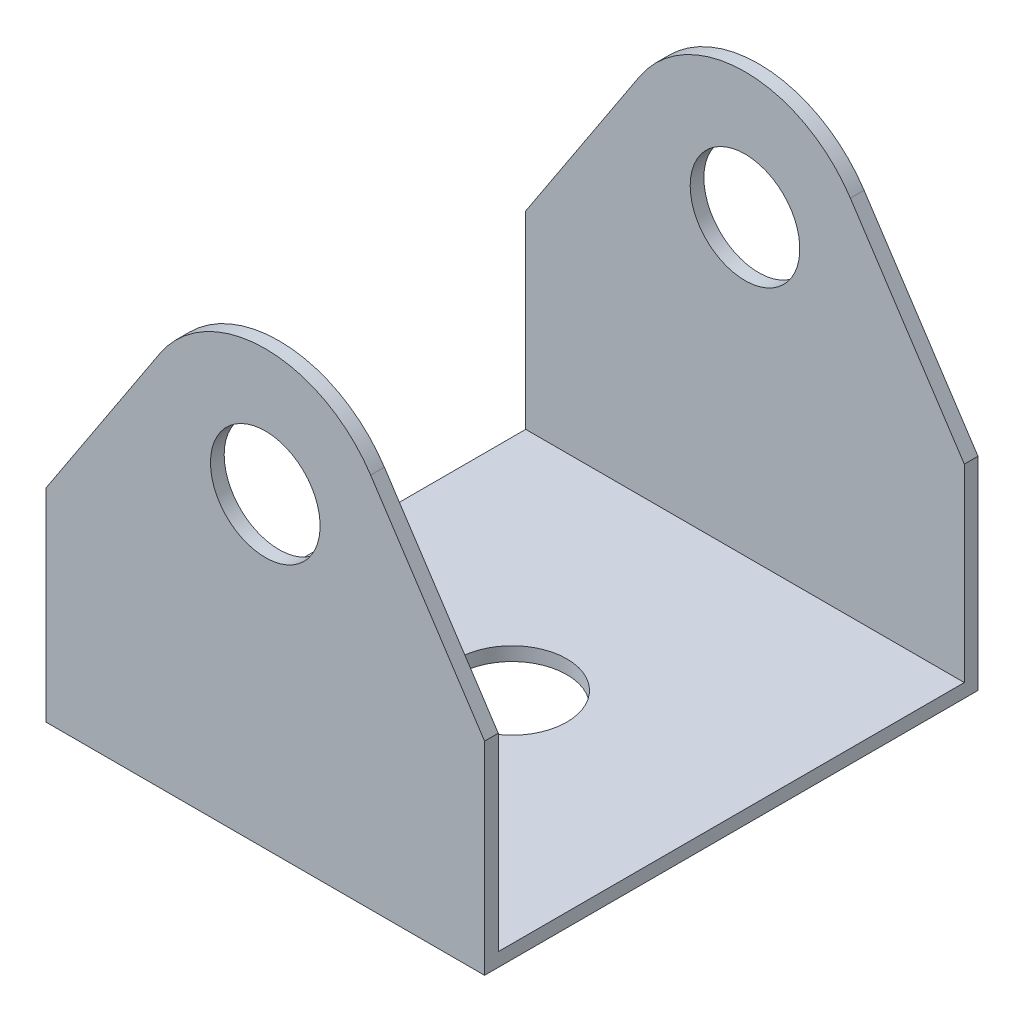
ISO-10303-21;
HEADER;
FILE_DESCRIPTION(('STEP AP214'),'2;1');
FILE_NAME('part.step','',(''),(''),'','','');
FILE_SCHEMA(('AUTOMOTIVE_DESIGN { 1 0 10303 214 1 1 1 1 }'));
ENDSEC;
DATA;
#1=APPLICATION_CONTEXT('core data for automotive mechanical design processes');
#2=APPLICATION_PROTOCOL_DEFINITION('international standard','automotive_design',2000,#1);
#3=PRODUCT_CONTEXT('',#1,'mechanical');
#4=PRODUCT('Part','Part','',(#3));
#5=PRODUCT_RELATED_PRODUCT_CATEGORY('part','',(#4));
#6=PRODUCT_DEFINITION_FORMATION('','',#4);
#7=PRODUCT_DEFINITION_CONTEXT('part definition',#1,'design');
#8=PRODUCT_DEFINITION('design','',#6,#7);
#9=PRODUCT_DEFINITION_SHAPE('','',#8);
#10=(LENGTH_UNIT() NAMED_UNIT(*) SI_UNIT(.MILLI.,.METRE.));
#11=(NAMED_UNIT(*) PLANE_ANGLE_UNIT() SI_UNIT($,.RADIAN.));
#12=(NAMED_UNIT(*) SI_UNIT($,.STERADIAN.) SOLID_ANGLE_UNIT());
#13=UNCERTAINTY_MEASURE_WITH_UNIT(LENGTH_MEASURE(1.E-05),#10,'distance_accuracy_value','');
#14=(GEOMETRIC_REPRESENTATION_CONTEXT(3) GLOBAL_UNCERTAINTY_ASSIGNED_CONTEXT((#13)) GLOBAL_UNIT_ASSIGNED_CONTEXT((#10,
#11,#12)) REPRESENTATION_CONTEXT('',''));
#15=CARTESIAN_POINT('',(0.,0.,0.));
#16=DIRECTION('',(0.,0.,1.));
#17=DIRECTION('',(1.,0.,0.));
#18=AXIS2_PLACEMENT_3D('',#15,#16,#17);
#19=CARTESIAN_POINT('',(40.,-19.,90.));
#20=DIRECTION('',(-0.835794870617099,-0.549041832878103,0.));
#21=DIRECTION('',(0.549041832878103,-0.835794870617099,0.));
#22=AXIS2_PLACEMENT_3D('',#19,#20,#21);
#23=PLANE('',#22);
#24=DIRECTION('',(-0.549041832878103,0.835794870617099,0.));
#25=VECTOR('',#24,1.);
#26=CARTESIAN_POINT('',(40.,-19.,2.5));
#27=LINE('',#26,#25);
#28=CARTESIAN_POINT('',(40.,-19.,2.5));
#29=VERTEX_POINT('',#28);
#30=CARTESIAN_POINT('',(19.2232820241933,12.6279621561964,2.5));
#31=VERTEX_POINT('',#30);
#32=EDGE_CURVE('E158',#29,#31,#27,.T.);
#33=ORIENTED_EDGE('',*,*,#32,.F.);
#34=DIRECTION('',(0.,0.,-1.));
#35=VECTOR('',#34,1.);
#36=CARTESIAN_POINT('',(40.,-19.,90.));
#37=LINE('',#36,#35);
#38=CARTESIAN_POINT('',(40.,-19.,0.));
#39=VERTEX_POINT('',#38);
#40=EDGE_CURVE('E150',#29,#39,#37,.T.);
#41=ORIENTED_EDGE('',*,*,#40,.T.);
#42=DIRECTION('',(-0.549041832878103,0.835794870617099,0.));
#43=VECTOR('',#42,1.);
#44=CARTESIAN_POINT('',(40.,-19.,0.));
#45=LINE('',#44,#43);
#46=CARTESIAN_POINT('',(19.2232820241933,12.6279621561964,0.));
#47=VERTEX_POINT('',#46);
#48=EDGE_CURVE('E167',#39,#47,#45,.T.);
#49=ORIENTED_EDGE('',*,*,#48,.T.);
#50=DIRECTION('',(0.,0.,-1.));
#51=VECTOR('',#50,1.);
#52=CARTESIAN_POINT('',(19.2232820241933,12.6279621561964,90.));
#53=LINE('',#52,#51);
#54=EDGE_CURVE('E46',#31,#47,#53,.T.);
#55=ORIENTED_EDGE('',*,*,#54,.F.);
#56=EDGE_LOOP('',(#33,#41,#49,#55));
#57=FACE_BOUND('',#56,.T.);
#58=ADVANCED_FACE('F37',(#57),#23,.F.);
#59=CARTESIAN_POINT('',(0.,0.,90.));
#60=DIRECTION('',(0.,0.,-1.));
#61=DIRECTION('',(-1.,0.,0.));
#62=AXIS2_PLACEMENT_3D('',#59,#60,#61);
#63=CYLINDRICAL_SURFACE('',#62,23.);
#64=CARTESIAN_POINT('',(0.,0.,2.5));
#65=DIRECTION('',(0.,0.,1.));
#66=DIRECTION('',(1.,0.,0.));
#67=AXIS2_PLACEMENT_3D('',#64,#65,#66);
#68=CIRCLE('',#67,23.);
#69=CARTESIAN_POINT('',(-19.2232820241933,12.6279621561964,2.5));
#70=VERTEX_POINT('',#69);
#71=EDGE_CURVE('E160',#31,#70,#68,.T.);
#72=ORIENTED_EDGE('',*,*,#71,.F.);
#73=ORIENTED_EDGE('',*,*,#54,.T.);
#74=CARTESIAN_POINT('',(0.,0.,0.));
#75=DIRECTION('',(0.,0.,1.));
#76=DIRECTION('',(1.,0.,0.));
#77=AXIS2_PLACEMENT_3D('',#74,#75,#76);
#78=CIRCLE('',#77,23.);
#79=CARTESIAN_POINT('',(-19.2232820241933,12.6279621561964,0.));
#80=VERTEX_POINT('',#79);
#81=EDGE_CURVE('E179',#47,#80,#78,.T.);
#82=ORIENTED_EDGE('',*,*,#81,.T.);
#83=DIRECTION('',(0.,0.,-1.));
#84=VECTOR('',#83,1.);
#85=CARTESIAN_POINT('',(-19.2232820241933,12.6279621561964,90.));
#86=LINE('',#85,#84);
#87=EDGE_CURVE('E215',#70,#80,#86,.T.);
#88=ORIENTED_EDGE('',*,*,#87,.F.);
#89=EDGE_LOOP('',(#72,#73,#82,#88));
#90=FACE_BOUND('',#89,.T.);
#91=ADVANCED_FACE('F267',(#90),#63,.T.);
#92=CARTESIAN_POINT('',(-40.,-19.,90.));
#93=DIRECTION('',(0.835794870617099,-0.549041832878103,0.));
#94=DIRECTION('',(0.549041832878103,0.835794870617099,0.));
#95=AXIS2_PLACEMENT_3D('',#92,#93,#94);
#96=PLANE('',#95);
#97=DIRECTION('',(-0.549041832878103,-0.835794870617099,0.));
#98=VECTOR('',#97,1.);
#99=CARTESIAN_POINT('',(-40.,-19.,2.5));
#100=LINE('',#99,#98);
#101=CARTESIAN_POINT('',(-40.,-19.,2.5));
#102=VERTEX_POINT('',#101);
#103=EDGE_CURVE('E163',#70,#102,#100,.T.);
#104=ORIENTED_EDGE('',*,*,#103,.F.);
#105=ORIENTED_EDGE('',*,*,#87,.T.);
#106=DIRECTION('',(-0.549041832878103,-0.835794870617099,0.));
#107=VECTOR('',#106,1.);
#108=CARTESIAN_POINT('',(-40.,-19.,0.));
#109=LINE('',#108,#107);
#110=CARTESIAN_POINT('',(-40.,-19.,0.));
#111=VERTEX_POINT('',#110);
#112=EDGE_CURVE('E182',#80,#111,#109,.T.);
#113=ORIENTED_EDGE('',*,*,#112,.T.);
#114=DIRECTION('',(0.,0.,-1.));
#115=VECTOR('',#114,1.);
#116=CARTESIAN_POINT('',(-40.,-19.,90.));
#117=LINE('',#116,#115);
#118=EDGE_CURVE('E211',#102,#111,#117,.T.);
#119=ORIENTED_EDGE('',*,*,#118,.F.);
#120=EDGE_LOOP('',(#104,#105,#113,#119));
#121=FACE_BOUND('',#120,.T.);
#122=ADVANCED_FACE('F263',(#121),#96,.F.);
#123=CARTESIAN_POINT('',(-40.,-19.,90.));
#124=DIRECTION('',(1.,0.,0.));
#125=DIRECTION('',(0.,1.,0.));
#126=AXIS2_PLACEMENT_3D('',#123,#124,#125);
#127=PLANE('',#126);
#128=DIRECTION('',(0.,-1.,0.));
#129=VECTOR('',#128,1.);
#130=CARTESIAN_POINT('',(-40.,-19.,2.5));
#131=LINE('',#130,#129);
#132=CARTESIAN_POINT('',(-40.,-53.5,2.5));
#133=VERTEX_POINT('',#132);
#134=EDGE_CURVE('E136',#102,#133,#131,.T.);
#135=ORIENTED_EDGE('',*,*,#134,.F.);
#136=ORIENTED_EDGE('',*,*,#118,.T.);
#137=DIRECTION('',(0.,-1.,0.));
#138=VECTOR('',#137,1.);
#139=CARTESIAN_POINT('',(-40.,-19.,0.));
#140=LINE('',#139,#138);
#141=CARTESIAN_POINT('',(-40.,-56.,0.));
#142=VERTEX_POINT('',#141);
#143=EDGE_CURVE('E185',#111,#142,#140,.T.);
#144=ORIENTED_EDGE('',*,*,#143,.T.);
#145=DIRECTION('',(0.,0.,-1.));
#146=VECTOR('',#145,1.);
#147=CARTESIAN_POINT('',(-40.,-56.,90.));
#148=LINE('',#147,#146);
#149=CARTESIAN_POINT('',(-40.,-56.,90.));
#150=VERTEX_POINT('',#149);
#151=EDGE_CURVE('E208',#150,#142,#148,.T.);
#152=ORIENTED_EDGE('',*,*,#151,.F.);
#153=DIRECTION('',(0.,-1.,0.));
#154=VECTOR('',#153,1.);
#155=CARTESIAN_POINT('',(-40.,-19.,90.));
#156=LINE('',#155,#154);
#157=CARTESIAN_POINT('',(-40.,-19.,90.));
#158=VERTEX_POINT('',#157);
#159=EDGE_CURVE('E197',#158,#150,#156,.T.);
#160=ORIENTED_EDGE('',*,*,#159,.F.);
#161=CARTESIAN_POINT('',(-40.,-19.,87.5));
#162=VERTEX_POINT('',#161);
#163=EDGE_CURVE('E212',#158,#162,#117,.T.);
#164=ORIENTED_EDGE('',*,*,#163,.T.);
#165=DIRECTION('',(0.,-1.,0.));
#166=VECTOR('',#165,1.);
#167=CARTESIAN_POINT('',(-40.,-19.,87.5));
#168=LINE('',#167,#166);
#169=CARTESIAN_POINT('',(-40.,-53.5,87.5));
#170=VERTEX_POINT('',#169);
#171=EDGE_CURVE('E168',#162,#170,#168,.T.);
#172=ORIENTED_EDGE('',*,*,#171,.T.);
#173=DIRECTION('',(0.,0.,-1.));
#174=VECTOR('',#173,1.);
#175=CARTESIAN_POINT('',(-40.,-53.5,90.));
#176=LINE('',#175,#174);
#177=EDGE_CURVE('E145',#170,#133,#176,.T.);
#178=ORIENTED_EDGE('',*,*,#177,.T.);
#179=EDGE_LOOP('',(#135,#136,#144,#152,#160,#164,#172,#178));
#180=FACE_BOUND('',#179,.T.);
#181=ADVANCED_FACE('F258',(#180),#127,.F.);
#182=CARTESIAN_POINT('',(40.,-19.,90.));
#183=DIRECTION('',(-1.,0.,0.));
#184=DIRECTION('',(0.,-1.,0.));
#185=AXIS2_PLACEMENT_3D('',#182,#183,#184);
#186=PLANE('',#185);
#187=DIRECTION('',(0.,1.,0.));
#188=VECTOR('',#187,1.);
#189=CARTESIAN_POINT('',(40.,-19.,2.5));
#190=LINE('',#189,#188);
#191=CARTESIAN_POINT('',(40.,-53.5,2.5));
#192=VERTEX_POINT('',#191);
#193=EDGE_CURVE('E133',#192,#29,#190,.T.);
#194=ORIENTED_EDGE('',*,*,#193,.F.);
#195=DIRECTION('',(0.,0.,-1.));
#196=VECTOR('',#195,1.);
#197=CARTESIAN_POINT('',(40.,-53.5,90.));
#198=LINE('',#197,#196);
#199=CARTESIAN_POINT('',(40.,-53.5,87.5));
#200=VERTEX_POINT('',#199);
#201=EDGE_CURVE('E141',#200,#192,#198,.T.);
#202=ORIENTED_EDGE('',*,*,#201,.F.);
#203=DIRECTION('',(0.,1.,0.));
#204=VECTOR('',#203,1.);
#205=CARTESIAN_POINT('',(40.,-19.,87.5));
#206=LINE('',#205,#204);
#207=CARTESIAN_POINT('',(40.,-19.,87.5));
#208=VERTEX_POINT('',#207);
#209=EDGE_CURVE('E54',#200,#208,#206,.T.);
#210=ORIENTED_EDGE('',*,*,#209,.T.);
#211=CARTESIAN_POINT('',(40.,-19.,90.));
#212=VERTEX_POINT('',#211);
#213=EDGE_CURVE('E202',#212,#208,#37,.T.);
#214=ORIENTED_EDGE('',*,*,#213,.F.);
#215=DIRECTION('',(0.,1.,0.));
#216=VECTOR('',#215,1.);
#217=CARTESIAN_POINT('',(40.,-19.,90.));
#218=LINE('',#217,#216);
#219=CARTESIAN_POINT('',(40.,-56.,90.));
#220=VERTEX_POINT('',#219);
#221=EDGE_CURVE('E62',#220,#212,#218,.T.);
#222=ORIENTED_EDGE('',*,*,#221,.F.);
#223=DIRECTION('',(0.,0.,-1.));
#224=VECTOR('',#223,1.);
#225=CARTESIAN_POINT('',(40.,-56.,90.));
#226=LINE('',#225,#224);
#227=CARTESIAN_POINT('',(40.,-56.,0.));
#228=VERTEX_POINT('',#227);
#229=EDGE_CURVE('E205',#220,#228,#226,.T.);
#230=ORIENTED_EDGE('',*,*,#229,.T.);
#231=DIRECTION('',(0.,1.,0.));
#232=VECTOR('',#231,1.);
#233=CARTESIAN_POINT('',(40.,-19.,0.));
#234=LINE('',#233,#232);
#235=EDGE_CURVE('E189',#228,#39,#234,.T.);
#236=ORIENTED_EDGE('',*,*,#235,.T.);
#237=ORIENTED_EDGE('',*,*,#40,.F.);
#238=EDGE_LOOP('',(#194,#202,#210,#214,#222,#230,#236,#237));
#239=FACE_BOUND('',#238,.T.);
#240=ADVANCED_FACE('F148',(#239),#186,.F.);
#241=ORIENTED_EDGE('',*,*,#213,.T.);
#242=DIRECTION('',(-0.549041832878103,0.835794870617099,0.));
#243=VECTOR('',#242,1.);
#244=CARTESIAN_POINT('',(40.,-19.,87.5));
#245=LINE('',#244,#243);
#246=CARTESIAN_POINT('',(19.2232820241933,12.6279621561964,87.5));
#247=VERTEX_POINT('',#246);
#248=EDGE_CURVE('E151',#208,#247,#245,.T.);
#249=ORIENTED_EDGE('',*,*,#248,.T.);
#250=CARTESIAN_POINT('',(19.2232820241933,12.6279621561964,90.));
#251=VERTEX_POINT('',#250);
#252=EDGE_CURVE('E11',#251,#247,#53,.T.);
#253=ORIENTED_EDGE('',*,*,#252,.F.);
#254=DIRECTION('',(-0.549041832878103,0.835794870617099,0.));
#255=VECTOR('',#254,1.);
#256=CARTESIAN_POINT('',(40.,-19.,90.));
#257=LINE('',#256,#255);
#258=EDGE_CURVE('E191',#212,#251,#257,.T.);
#259=ORIENTED_EDGE('',*,*,#258,.F.);
#260=EDGE_LOOP('',(#241,#249,#253,#259));
#261=FACE_BOUND('',#260,.T.);
#262=ADVANCED_FACE('F39',(#261),#23,.F.);
#263=ORIENTED_EDGE('',*,*,#252,.T.);
#264=CARTESIAN_POINT('',(0.,0.,87.5));
#265=DIRECTION('',(0.,0.,1.));
#266=DIRECTION('',(1.,0.,0.));
#267=AXIS2_PLACEMENT_3D('',#264,#265,#266);
#268=CIRCLE('',#267,23.);
#269=CARTESIAN_POINT('',(-19.2232820241933,12.6279621561964,87.5));
#270=VERTEX_POINT('',#269);
#271=EDGE_CURVE('E154',#247,#270,#268,.T.);
#272=ORIENTED_EDGE('',*,*,#271,.T.);
#273=CARTESIAN_POINT('',(-19.2232820241933,12.6279621561964,90.));
#274=VERTEX_POINT('',#273);
#275=EDGE_CURVE('E216',#274,#270,#86,.T.);
#276=ORIENTED_EDGE('',*,*,#275,.F.);
#277=CARTESIAN_POINT('',(0.,0.,90.));
#278=DIRECTION('',(0.,0.,1.));
#279=DIRECTION('',(1.,0.,0.));
#280=AXIS2_PLACEMENT_3D('',#277,#278,#279);
#281=CIRCLE('',#280,23.);
#282=EDGE_CURVE('E193',#251,#274,#281,.T.);
#283=ORIENTED_EDGE('',*,*,#282,.F.);
#284=EDGE_LOOP('',(#263,#272,#276,#283));
#285=FACE_BOUND('',#284,.T.);
#286=ADVANCED_FACE('F269',(#285),#63,.T.);
#287=ORIENTED_EDGE('',*,*,#275,.T.);
#288=DIRECTION('',(-0.549041832878103,-0.835794870617099,0.));
#289=VECTOR('',#288,1.);
#290=CARTESIAN_POINT('',(-40.,-19.,87.5));
#291=LINE('',#290,#289);
#292=EDGE_CURVE('E171',#270,#162,#291,.T.);
#293=ORIENTED_EDGE('',*,*,#292,.T.);
#294=ORIENTED_EDGE('',*,*,#163,.F.);
#295=DIRECTION('',(-0.549041832878103,-0.835794870617099,0.));
#296=VECTOR('',#295,1.);
#297=CARTESIAN_POINT('',(-40.,-19.,90.));
#298=LINE('',#297,#296);
#299=EDGE_CURVE('E195',#274,#158,#298,.T.);
#300=ORIENTED_EDGE('',*,*,#299,.F.);
#301=EDGE_LOOP('',(#287,#293,#294,#300));
#302=FACE_BOUND('',#301,.T.);
#303=ADVANCED_FACE('F275',(#302),#96,.F.);
#304=CARTESIAN_POINT('',(40.,-56.,90.));
#305=DIRECTION('',(0.,1.,0.));
#306=DIRECTION('',(0.,0.,1.));
#307=AXIS2_PLACEMENT_3D('',#304,#305,#306);
#308=PLANE('',#307);
#309=CARTESIAN_POINT('',(0.,-56.,45.));
#310=DIRECTION('',(0.,-1.,0.));
#311=DIRECTION('',(0.,0.,-1.));
#312=AXIS2_PLACEMENT_3D('',#309,#310,#311);
#313=CIRCLE('',#312,10.);
#314=CARTESIAN_POINT('',(0.,-56.,35.));
#315=VERTEX_POINT('',#314);
#316=EDGE_CURVE('E219',#315,#315,#313,.T.);
#317=ORIENTED_EDGE('',*,*,#316,.F.);
#318=EDGE_LOOP('',(#317));
#319=FACE_BOUND('',#318,.T.);
#320=DIRECTION('',(1.,0.,0.));
#321=VECTOR('',#320,1.);
#322=CARTESIAN_POINT('',(40.,-56.,0.));
#323=LINE('',#322,#321);
#324=EDGE_CURVE('E187',#142,#228,#323,.T.);
#325=ORIENTED_EDGE('',*,*,#324,.T.);
#326=ORIENTED_EDGE('',*,*,#229,.F.);
#327=DIRECTION('',(1.,0.,0.));
#328=VECTOR('',#327,1.);
#329=CARTESIAN_POINT('',(40.,-56.,90.));
#330=LINE('',#329,#328);
#331=EDGE_CURVE('E199',#150,#220,#330,.T.);
#332=ORIENTED_EDGE('',*,*,#331,.F.);
#333=ORIENTED_EDGE('',*,*,#151,.T.);
#334=EDGE_LOOP('',(#325,#326,#332,#333));
#335=FACE_BOUND('',#334,.T.);
#336=ADVANCED_FACE('F254',(#319,#335),#308,.F.);
#337=CARTESIAN_POINT('',(0.,0.,90.));
#338=DIRECTION('',(0.,0.,1.));
#339=DIRECTION('',(1.,0.,0.));
#340=AXIS2_PLACEMENT_3D('',#337,#338,#339);
#341=PLANE('',#340);
#342=CARTESIAN_POINT('',(0.,0.,90.));
#343=DIRECTION('',(0.,0.,-1.));
#344=DIRECTION('',(-1.,0.,0.));
#345=AXIS2_PLACEMENT_3D('',#342,#343,#344);
#346=CIRCLE('',#345,10.);
#347=CARTESIAN_POINT('',(-10.,0.,90.));
#348=VERTEX_POINT('',#347);
#349=EDGE_CURVE('E230',#348,#348,#346,.T.);
#350=ORIENTED_EDGE('',*,*,#349,.T.);
#351=EDGE_LOOP('',(#350));
#352=FACE_BOUND('',#351,.T.);
#353=ORIENTED_EDGE('',*,*,#258,.T.);
#354=ORIENTED_EDGE('',*,*,#282,.T.);
#355=ORIENTED_EDGE('',*,*,#299,.T.);
#356=ORIENTED_EDGE('',*,*,#159,.T.);
#357=ORIENTED_EDGE('',*,*,#331,.T.);
#358=ORIENTED_EDGE('',*,*,#221,.T.);
#359=EDGE_LOOP('',(#353,#354,#355,#356,#357,#358));
#360=FACE_BOUND('',#359,.T.);
#361=ADVANCED_FACE('F242',(#352,#360),#341,.T.);
#362=CARTESIAN_POINT('',(0.,0.,0.));
#363=DIRECTION('',(0.,0.,1.));
#364=DIRECTION('',(1.,0.,0.));
#365=AXIS2_PLACEMENT_3D('',#362,#363,#364);
#366=PLANE('',#365);
#367=CARTESIAN_POINT('',(0.,0.,0.));
#368=DIRECTION('',(0.,0.,-1.));
#369=DIRECTION('',(-1.,0.,0.));
#370=AXIS2_PLACEMENT_3D('',#367,#368,#369);
#371=CIRCLE('',#370,10.);
#372=CARTESIAN_POINT('',(-10.,0.,0.));
#373=VERTEX_POINT('',#372);
#374=EDGE_CURVE('E233',#373,#373,#371,.T.);
#375=ORIENTED_EDGE('',*,*,#374,.F.);
#376=EDGE_LOOP('',(#375));
#377=FACE_BOUND('',#376,.T.);
#378=ORIENTED_EDGE('',*,*,#48,.F.);
#379=ORIENTED_EDGE('',*,*,#235,.F.);
#380=ORIENTED_EDGE('',*,*,#324,.F.);
#381=ORIENTED_EDGE('',*,*,#143,.F.);
#382=ORIENTED_EDGE('',*,*,#112,.F.);
#383=ORIENTED_EDGE('',*,*,#81,.F.);
#384=EDGE_LOOP('',(#378,#379,#380,#381,#382,#383));
#385=FACE_BOUND('',#384,.T.);
#386=ADVANCED_FACE('F239',(#377,#385),#366,.F.);
#387=CARTESIAN_POINT('',(40.,-53.5,90.));
#388=DIRECTION('',(0.,1.,0.));
#389=DIRECTION('',(0.,0.,1.));
#390=AXIS2_PLACEMENT_3D('',#387,#388,#389);
#391=PLANE('',#390);
#392=CARTESIAN_POINT('',(0.,-53.5,45.));
#393=DIRECTION('',(0.,1.,0.));
#394=DIRECTION('',(0.,0.,1.));
#395=AXIS2_PLACEMENT_3D('',#392,#393,#394);
#396=CIRCLE('',#395,10.);
#397=CARTESIAN_POINT('',(0.,-53.5,35.));
#398=VERTEX_POINT('',#397);
#399=EDGE_CURVE('E161',#398,#398,#396,.T.);
#400=ORIENTED_EDGE('',*,*,#399,.F.);
#401=EDGE_LOOP('',(#400));
#402=FACE_BOUND('',#401,.T.);
#403=DIRECTION('',(1.,0.,0.));
#404=VECTOR('',#403,1.);
#405=CARTESIAN_POINT('',(40.,-53.5,2.5));
#406=LINE('',#405,#404);
#407=EDGE_CURVE('E129',#133,#192,#406,.T.);
#408=ORIENTED_EDGE('',*,*,#407,.F.);
#409=ORIENTED_EDGE('',*,*,#177,.F.);
#410=DIRECTION('',(1.,0.,0.));
#411=VECTOR('',#410,1.);
#412=CARTESIAN_POINT('',(40.,-53.5,87.5));
#413=LINE('',#412,#411);
#414=EDGE_CURVE('E143',#170,#200,#413,.T.);
#415=ORIENTED_EDGE('',*,*,#414,.T.);
#416=ORIENTED_EDGE('',*,*,#201,.T.);
#417=EDGE_LOOP('',(#408,#409,#415,#416));
#418=FACE_BOUND('',#417,.T.);
#419=ADVANCED_FACE('F142',(#402,#418),#391,.T.);
#420=CARTESIAN_POINT('',(0.,0.,87.5));
#421=DIRECTION('',(0.,0.,1.));
#422=DIRECTION('',(1.,0.,0.));
#423=AXIS2_PLACEMENT_3D('',#420,#421,#422);
#424=PLANE('',#423);
#425=CARTESIAN_POINT('',(0.,0.,87.5));
#426=DIRECTION('',(0.,0.,1.));
#427=DIRECTION('',(1.,0.,0.));
#428=AXIS2_PLACEMENT_3D('',#425,#426,#427);
#429=CIRCLE('',#428,10.);
#430=CARTESIAN_POINT('',(-10.,0.,87.5));
#431=VERTEX_POINT('',#430);
#432=EDGE_CURVE('E223',#431,#431,#429,.T.);
#433=ORIENTED_EDGE('',*,*,#432,.T.);
#434=EDGE_LOOP('',(#433));
#435=FACE_BOUND('',#434,.T.);
#436=ORIENTED_EDGE('',*,*,#248,.F.);
#437=ORIENTED_EDGE('',*,*,#209,.F.);
#438=ORIENTED_EDGE('',*,*,#414,.F.);
#439=ORIENTED_EDGE('',*,*,#171,.F.);
#440=ORIENTED_EDGE('',*,*,#292,.F.);
#441=ORIENTED_EDGE('',*,*,#271,.F.);
#442=EDGE_LOOP('',(#436,#437,#438,#439,#440,#441));
#443=FACE_BOUND('',#442,.T.);
#444=ADVANCED_FACE('F287',(#435,#443),#424,.F.);
#445=CARTESIAN_POINT('',(0.,0.,2.5));
#446=DIRECTION('',(0.,0.,1.));
#447=DIRECTION('',(1.,0.,0.));
#448=AXIS2_PLACEMENT_3D('',#445,#446,#447);
#449=PLANE('',#448);
#450=CARTESIAN_POINT('',(0.,0.,2.5));
#451=DIRECTION('',(0.,0.,1.));
#452=DIRECTION('',(1.,0.,0.));
#453=AXIS2_PLACEMENT_3D('',#450,#451,#452);
#454=CIRCLE('',#453,10.);
#455=CARTESIAN_POINT('',(-10.,0.,2.49999999999999));
#456=VERTEX_POINT('',#455);
#457=EDGE_CURVE('E41',#456,#456,#454,.T.);
#458=ORIENTED_EDGE('',*,*,#457,.F.);
#459=EDGE_LOOP('',(#458));
#460=FACE_BOUND('',#459,.T.);
#461=ORIENTED_EDGE('',*,*,#32,.T.);
#462=ORIENTED_EDGE('',*,*,#71,.T.);
#463=ORIENTED_EDGE('',*,*,#103,.T.);
#464=ORIENTED_EDGE('',*,*,#134,.T.);
#465=ORIENTED_EDGE('',*,*,#407,.T.);
#466=ORIENTED_EDGE('',*,*,#193,.T.);
#467=EDGE_LOOP('',(#461,#462,#463,#464,#465,#466));
#468=FACE_BOUND('',#467,.T.);
#469=ADVANCED_FACE('F131',(#460,#468),#449,.T.);
#470=CARTESIAN_POINT('',(0.,34.,45.));
#471=DIRECTION('',(0.,-1.,0.));
#472=DIRECTION('',(0.,0.,-1.));
#473=AXIS2_PLACEMENT_3D('',#470,#471,#472);
#474=CYLINDRICAL_SURFACE('',#473,10.);
#475=CARTESIAN_POINT('',(0.,-53.5,35.));
#476=CARTESIAN_POINT('',(0.,-53.5260416666667,35.));
#477=CARTESIAN_POINT('',(0.,-53.5520833333333,35.));
#478=CARTESIAN_POINT('',(0.,-53.6041666666667,35.));
#479=CARTESIAN_POINT('',(0.,-53.6302083333333,35.));
#480=CARTESIAN_POINT('',(0.,-53.6822916666667,35.));
#481=CARTESIAN_POINT('',(0.,-53.7083333333333,35.));
#482=CARTESIAN_POINT('',(0.,-53.7604166666667,35.));
#483=CARTESIAN_POINT('',(0.,-53.7864583333333,35.));
#484=CARTESIAN_POINT('',(0.,-53.8385416666667,35.));
#485=CARTESIAN_POINT('',(0.,-53.8645833333333,35.));
#486=CARTESIAN_POINT('',(0.,-53.9166666666667,35.));
#487=CARTESIAN_POINT('',(0.,-53.9427083333333,35.));
#488=CARTESIAN_POINT('',(0.,-53.9947916666667,35.));
#489=CARTESIAN_POINT('',(0.,-54.0208333333333,35.));
#490=CARTESIAN_POINT('',(0.,-54.0729166666667,35.));
#491=CARTESIAN_POINT('',(0.,-54.0989583333333,35.));
#492=CARTESIAN_POINT('',(0.,-54.1510416666667,35.));
#493=CARTESIAN_POINT('',(0.,-54.1770833333333,35.));
#494=CARTESIAN_POINT('',(0.,-54.2291666666667,35.));
#495=CARTESIAN_POINT('',(0.,-54.2552083333333,35.));
#496=CARTESIAN_POINT('',(0.,-54.3072916666667,35.));
#497=CARTESIAN_POINT('',(0.,-54.3333333333333,35.));
#498=CARTESIAN_POINT('',(0.,-54.3854166666667,35.));
#499=CARTESIAN_POINT('',(0.,-54.4114583333333,35.));
#500=CARTESIAN_POINT('',(0.,-54.4635416666667,35.));
#501=CARTESIAN_POINT('',(0.,-54.4895833333333,35.));
#502=CARTESIAN_POINT('',(0.,-54.5416666666667,35.));
#503=CARTESIAN_POINT('',(0.,-54.5677083333333,35.));
#504=CARTESIAN_POINT('',(0.,-54.6197916666667,35.));
#505=CARTESIAN_POINT('',(0.,-54.6458333333333,35.));
#506=CARTESIAN_POINT('',(0.,-54.6979166666667,35.));
#507=CARTESIAN_POINT('',(0.,-54.7239583333333,35.));
#508=CARTESIAN_POINT('',(0.,-54.7760416666667,35.));
#509=CARTESIAN_POINT('',(0.,-54.8020833333333,35.));
#510=CARTESIAN_POINT('',(0.,-54.8541666666667,35.));
#511=CARTESIAN_POINT('',(0.,-54.8802083333333,35.));
#512=CARTESIAN_POINT('',(0.,-54.9322916666667,35.));
#513=CARTESIAN_POINT('',(0.,-54.9583333333333,35.));
#514=CARTESIAN_POINT('',(0.,-55.0104166666667,35.));
#515=CARTESIAN_POINT('',(0.,-55.0364583333333,35.));
#516=CARTESIAN_POINT('',(0.,-55.0885416666667,35.));
#517=CARTESIAN_POINT('',(0.,-55.1145833333333,35.));
#518=CARTESIAN_POINT('',(0.,-55.1666666666667,35.));
#519=CARTESIAN_POINT('',(0.,-55.1927083333333,35.));
#520=CARTESIAN_POINT('',(0.,-55.2447916666667,35.));
#521=CARTESIAN_POINT('',(0.,-55.2708333333333,35.));
#522=CARTESIAN_POINT('',(0.,-55.3229166666667,35.));
#523=CARTESIAN_POINT('',(0.,-55.3489583333333,35.));
#524=CARTESIAN_POINT('',(0.,-55.4010416666667,35.));
#525=CARTESIAN_POINT('',(0.,-55.4270833333333,35.));
#526=CARTESIAN_POINT('',(0.,-55.4791666666667,35.));
#527=CARTESIAN_POINT('',(0.,-55.5052083333333,35.));
#528=CARTESIAN_POINT('',(0.,-55.5572916666667,35.));
#529=CARTESIAN_POINT('',(0.,-55.5833333333333,35.));
#530=CARTESIAN_POINT('',(0.,-55.6354166666667,35.));
#531=CARTESIAN_POINT('',(0.,-55.6614583333333,35.));
#532=CARTESIAN_POINT('',(0.,-55.7135416666667,35.));
#533=CARTESIAN_POINT('',(0.,-55.7395833333333,35.));
#534=CARTESIAN_POINT('',(0.,-55.7916666666667,35.));
#535=CARTESIAN_POINT('',(0.,-55.8177083333333,35.));
#536=CARTESIAN_POINT('',(0.,-55.8697916666667,35.));
#537=CARTESIAN_POINT('',(0.,-55.8958333333333,35.));
#538=CARTESIAN_POINT('',(0.,-55.9479166666667,35.));
#539=CARTESIAN_POINT('',(0.,-55.9739583333333,35.));
#540=CARTESIAN_POINT('',(0.,-56.,35.));
#541=B_SPLINE_CURVE_WITH_KNOTS('',3,(#475,#476,#477,#478,#479,#480,#481,#482,#483,#484,#485,
#486,#487,#488,#489,#490,#491,#492,#493,#494,#495,#496,#497,#498,#499,#500,#501,#502,#503,#504,
#505,#506,#507,#508,#509,#510,#511,#512,#513,#514,#515,#516,#517,#518,#519,#520,#521,#522,#523,
#524,#525,#526,#527,#528,#529,#530,#531,#532,#533,#534,#535,#536,#537,#538,#539,#540),
.UNSPECIFIED.,.F.,.F.,(4,2,2,2,2,2,2,2,2,2,2,2,2,2,2,2,2,2,2,2,2,2,2,2,2,2,2,2,2,2,2,2,4),(0.,
0.0781249999999983,0.156249999999997,0.234374999999995,0.312499999999993,0.390625000000006,
0.468750000000004,0.546875000000002,0.625000000000001,0.703124999999999,0.781249999999997,
0.859374999999996,0.937500000000008,1.01562500000001,1.09375,1.171875,1.25,1.328125,1.40625,
1.484375,1.56249999999999,1.64062500000001,1.71875,1.796875,1.875,1.953125,2.03125,2.109375,
2.18750000000001,2.26562500000001,2.34375000000001,2.421875,2.5),.UNSPECIFIED.);
#542=EDGE_CURVE('BSEAM349',#398,#315,#541,.T.);
#543=ORIENTED_EDGE('',*,*,#399,.T.);
#544=ORIENTED_EDGE('',*,*,#316,.T.);
#545=ORIENTED_EDGE('',*,*,#542,.T.);
#546=ORIENTED_EDGE('',*,*,#542,.F.);
#547=EDGE_LOOP('',(#543,#545,#544,#546));
#548=FACE_BOUND('',#547,.T.);
#549=ADVANCED_FACE('F349',(#548),#474,.F.);
#550=CARTESIAN_POINT('',(0.,0.,90.));
#551=DIRECTION('',(0.,0.,-1.));
#552=DIRECTION('',(-1.,0.,0.));
#553=AXIS2_PLACEMENT_3D('',#550,#551,#552);
#554=CYLINDRICAL_SURFACE('',#553,10.);
#555=CARTESIAN_POINT('',(-10.,0.,2.49999999999999));
#556=CARTESIAN_POINT('',(-10.,0.,2.47395833333332));
#557=CARTESIAN_POINT('',(-10.,0.,2.44791666666666));
#558=CARTESIAN_POINT('',(-10.,0.,2.39583333333332));
#559=CARTESIAN_POINT('',(-10.,0.,2.36979166666666));
#560=CARTESIAN_POINT('',(-10.,0.,2.31770833333333));
#561=CARTESIAN_POINT('',(-10.,0.,2.29166666666666));
#562=CARTESIAN_POINT('',(-10.,0.,2.23958333333333));
#563=CARTESIAN_POINT('',(-10.,0.,2.21354166666666));
#564=CARTESIAN_POINT('',(-10.,0.,2.16145833333333));
#565=CARTESIAN_POINT('',(-10.,0.,2.13541666666666));
#566=CARTESIAN_POINT('',(-10.,0.,2.08333333333333));
#567=CARTESIAN_POINT('',(-10.,0.,2.05729166666666));
#568=CARTESIAN_POINT('',(-10.,0.,2.00520833333333));
#569=CARTESIAN_POINT('',(-10.,0.,1.97916666666667));
#570=CARTESIAN_POINT('',(-10.,0.,1.92708333333333));
#571=CARTESIAN_POINT('',(-10.,0.,1.90104166666667));
#572=CARTESIAN_POINT('',(-10.,0.,1.84895833333333));
#573=CARTESIAN_POINT('',(-10.,0.,1.82291666666666));
#574=CARTESIAN_POINT('',(-10.,0.,1.77083333333332));
#575=CARTESIAN_POINT('',(-10.,0.,1.74479166666666));
#576=CARTESIAN_POINT('',(-10.,0.,1.69270833333333));
#577=CARTESIAN_POINT('',(-10.,0.,1.66666666666666));
#578=CARTESIAN_POINT('',(-10.,0.,1.61458333333333));
#579=CARTESIAN_POINT('',(-10.,0.,1.58854166666666));
#580=CARTESIAN_POINT('',(-10.,0.,1.53645833333333));
#581=CARTESIAN_POINT('',(-10.,0.,1.51041666666666));
#582=CARTESIAN_POINT('',(-10.,0.,1.45833333333333));
#583=CARTESIAN_POINT('',(-10.,0.,1.43229166666666));
#584=CARTESIAN_POINT('',(-10.,0.,1.38020833333333));
#585=CARTESIAN_POINT('',(-10.,0.,1.35416666666667));
#586=CARTESIAN_POINT('',(-10.,0.,1.30208333333333));
#587=CARTESIAN_POINT('',(-10.,0.,1.27604166666667));
#588=CARTESIAN_POINT('',(-10.,0.,1.22395833333334));
#589=CARTESIAN_POINT('',(-10.,0.,1.19791666666667));
#590=CARTESIAN_POINT('',(-10.,0.,1.14583333333334));
#591=CARTESIAN_POINT('',(-10.,0.,1.11979166666667));
#592=CARTESIAN_POINT('',(-10.,0.,1.06770833333334));
#593=CARTESIAN_POINT('',(-10.,0.,1.04166666666667));
#594=CARTESIAN_POINT('',(-10.,0.,0.98958333333334));
#595=CARTESIAN_POINT('',(-10.,0.,0.963541666666674));
#596=CARTESIAN_POINT('',(-10.,0.,0.911458333333342));
#597=CARTESIAN_POINT('',(-10.,0.,0.885416666666676));
#598=CARTESIAN_POINT('',(-10.,0.,0.833333333333343));
#599=CARTESIAN_POINT('',(-10.,0.,0.807291666666677));
#600=CARTESIAN_POINT('',(-10.,0.,0.755208333333345));
#601=CARTESIAN_POINT('',(-10.,0.,0.729166666666679));
#602=CARTESIAN_POINT('',(-10.,0.,0.677083333333342));
#603=CARTESIAN_POINT('',(-10.,0.,0.651041666666671));
#604=CARTESIAN_POINT('',(-10.,0.,0.598958333333334));
#605=CARTESIAN_POINT('',(-10.,0.,0.572916666666668));
#606=CARTESIAN_POINT('',(-10.,0.,0.520833333333336));
#607=CARTESIAN_POINT('',(-10.,0.,0.49479166666667));
#608=CARTESIAN_POINT('',(-10.,0.,0.442708333333338));
#609=CARTESIAN_POINT('',(-10.,0.,0.416666666666672));
#610=CARTESIAN_POINT('',(-10.,0.,0.364583333333339));
#611=CARTESIAN_POINT('',(-10.,0.,0.338541666666673));
#612=CARTESIAN_POINT('',(-10.,0.,0.286458333333341));
#613=CARTESIAN_POINT('',(-10.,0.,0.260416666666675));
#614=CARTESIAN_POINT('',(-10.,0.,0.208333333333343));
#615=CARTESIAN_POINT('',(-10.,0.,0.182291666666677));
#616=CARTESIAN_POINT('',(-10.,0.,0.130208333333344));
#617=CARTESIAN_POINT('',(-10.,0.,0.104166666666678));
#618=CARTESIAN_POINT('',(-10.,0.,0.0520833333333461));
#619=CARTESIAN_POINT('',(-10.,0.,0.02604166666668));
#620=CARTESIAN_POINT('',(-10.,0.,0.));
#621=B_SPLINE_CURVE_WITH_KNOTS('',3,(#555,#556,#557,#558,#559,#560,#561,#562,#563,#564,#565,
#566,#567,#568,#569,#570,#571,#572,#573,#574,#575,#576,#577,#578,#579,#580,#581,#582,#583,#584,
#585,#586,#587,#588,#589,#590,#591,#592,#593,#594,#595,#596,#597,#598,#599,#600,#601,#602,#603,
#604,#605,#606,#607,#608,#609,#610,#611,#612,#613,#614,#615,#616,#617,#618,#619,#620),
.UNSPECIFIED.,.F.,.F.,(4,2,2,2,2,2,2,2,2,2,2,2,2,2,2,2,2,2,2,2,2,2,2,2,2,2,2,2,2,2,2,2,4),(0.,
0.0781249999999983,0.156249999999997,0.234374999999995,0.312499999999993,0.390624999999992,
0.46874999999999,0.546874999999988,0.624999999999987,0.703124999999999,0.781249999999997,
0.859374999999996,0.937499999999994,1.01562499999999,1.09374999999999,1.17187499999999,
1.24999999999999,1.32812499999999,1.40624999999998,1.48437499999998,1.56249999999998,
1.64062499999998,1.71874999999998,1.79687499999998,1.87499999999999,1.95312499999999,
2.03124999999998,2.10937499999998,2.18749999999998,2.26562499999998,2.34374999999998,
2.42187499999998,2.49999999999997),.UNSPECIFIED.);
#622=EDGE_CURVE('BSEAM237',#456,#373,#621,.T.);
#623=ORIENTED_EDGE('',*,*,#457,.T.);
#624=ORIENTED_EDGE('',*,*,#374,.T.);
#625=ORIENTED_EDGE('',*,*,#622,.T.);
#626=ORIENTED_EDGE('',*,*,#622,.F.);
#627=EDGE_LOOP('',(#623,#625,#624,#626));
#628=FACE_BOUND('',#627,.T.);
#629=ADVANCED_FACE('F237',(#628),#554,.F.);
#630=CARTESIAN_POINT('',(-10.,0.,90.));
#631=CARTESIAN_POINT('',(-10.,0.,89.9739583333333));
#632=CARTESIAN_POINT('',(-10.,0.,89.9479166666667));
#633=CARTESIAN_POINT('',(-10.,0.,89.8958333333333));
#634=CARTESIAN_POINT('',(-10.,0.,89.8697916666667));
#635=CARTESIAN_POINT('',(-10.,0.,89.8177083333333));
#636=CARTESIAN_POINT('',(-10.,0.,89.7916666666667));
#637=CARTESIAN_POINT('',(-10.,0.,89.7395833333333));
#638=CARTESIAN_POINT('',(-10.,0.,89.7135416666667));
#639=CARTESIAN_POINT('',(-10.,0.,89.6614583333333));
#640=CARTESIAN_POINT('',(-10.,0.,89.6354166666667));
#641=CARTESIAN_POINT('',(-10.,0.,89.5833333333333));
#642=CARTESIAN_POINT('',(-10.,0.,89.5572916666667));
#643=CARTESIAN_POINT('',(-10.,0.,89.5052083333333));
#644=CARTESIAN_POINT('',(-10.,0.,89.4791666666667));
#645=CARTESIAN_POINT('',(-10.,0.,89.4270833333333));
#646=CARTESIAN_POINT('',(-10.,0.,89.4010416666667));
#647=CARTESIAN_POINT('',(-10.,0.,89.3489583333333));
#648=CARTESIAN_POINT('',(-10.,0.,89.3229166666667));
#649=CARTESIAN_POINT('',(-10.,0.,89.2708333333333));
#650=CARTESIAN_POINT('',(-10.,0.,89.2447916666667));
#651=CARTESIAN_POINT('',(-10.,0.,89.1927083333333));
#652=CARTESIAN_POINT('',(-10.,0.,89.1666666666667));
#653=CARTESIAN_POINT('',(-10.,0.,89.1145833333333));
#654=CARTESIAN_POINT('',(-10.,0.,89.0885416666667));
#655=CARTESIAN_POINT('',(-10.,0.,89.0364583333333));
#656=CARTESIAN_POINT('',(-10.,0.,89.0104166666667));
#657=CARTESIAN_POINT('',(-10.,0.,88.9583333333333));
#658=CARTESIAN_POINT('',(-10.,0.,88.9322916666667));
#659=CARTESIAN_POINT('',(-10.,0.,88.8802083333333));
#660=CARTESIAN_POINT('',(-10.,0.,88.8541666666667));
#661=CARTESIAN_POINT('',(-10.,0.,88.8020833333333));
#662=CARTESIAN_POINT('',(-10.,0.,88.7760416666667));
#663=CARTESIAN_POINT('',(-10.,0.,88.7239583333333));
#664=CARTESIAN_POINT('',(-10.,0.,88.6979166666667));
#665=CARTESIAN_POINT('',(-10.,0.,88.6458333333333));
#666=CARTESIAN_POINT('',(-10.,0.,88.6197916666667));
#667=CARTESIAN_POINT('',(-10.,0.,88.5677083333333));
#668=CARTESIAN_POINT('',(-10.,0.,88.5416666666667));
#669=CARTESIAN_POINT('',(-10.,0.,88.4895833333333));
#670=CARTESIAN_POINT('',(-10.,0.,88.4635416666667));
#671=CARTESIAN_POINT('',(-10.,0.,88.4114583333333));
#672=CARTESIAN_POINT('',(-10.,0.,88.3854166666667));
#673=CARTESIAN_POINT('',(-10.,0.,88.3333333333333));
#674=CARTESIAN_POINT('',(-10.,0.,88.3072916666667));
#675=CARTESIAN_POINT('',(-10.,0.,88.2552083333333));
#676=CARTESIAN_POINT('',(-10.,0.,88.2291666666667));
#677=CARTESIAN_POINT('',(-10.,0.,88.1770833333333));
#678=CARTESIAN_POINT('',(-10.,0.,88.1510416666667));
#679=CARTESIAN_POINT('',(-10.,0.,88.0989583333333));
#680=CARTESIAN_POINT('',(-10.,0.,88.0729166666667));
#681=CARTESIAN_POINT('',(-10.,0.,88.0208333333333));
#682=CARTESIAN_POINT('',(-10.,0.,87.9947916666667));
#683=CARTESIAN_POINT('',(-10.,0.,87.9427083333333));
#684=CARTESIAN_POINT('',(-10.,0.,87.9166666666667));
#685=CARTESIAN_POINT('',(-10.,0.,87.8645833333333));
#686=CARTESIAN_POINT('',(-10.,0.,87.8385416666667));
#687=CARTESIAN_POINT('',(-10.,0.,87.7864583333333));
#688=CARTESIAN_POINT('',(-10.,0.,87.7604166666667));
#689=CARTESIAN_POINT('',(-10.,0.,87.7083333333333));
#690=CARTESIAN_POINT('',(-10.,0.,87.6822916666667));
#691=CARTESIAN_POINT('',(-10.,0.,87.6302083333333));
#692=CARTESIAN_POINT('',(-10.,0.,87.6041666666667));
#693=CARTESIAN_POINT('',(-10.,0.,87.5520833333333));
#694=CARTESIAN_POINT('',(-10.,0.,87.5260416666667));
#695=CARTESIAN_POINT('',(-10.,0.,87.5));
#696=B_SPLINE_CURVE_WITH_KNOTS('',3,(#630,#631,#632,#633,#634,#635,#636,#637,#638,#639,#640,
#641,#642,#643,#644,#645,#646,#647,#648,#649,#650,#651,#652,#653,#654,#655,#656,#657,#658,#659,
#660,#661,#662,#663,#664,#665,#666,#667,#668,#669,#670,#671,#672,#673,#674,#675,#676,#677,#678,
#679,#680,#681,#682,#683,#684,#685,#686,#687,#688,#689,#690,#691,#692,#693,#694,#695),
.UNSPECIFIED.,.F.,.F.,(4,2,2,2,2,2,2,2,2,2,2,2,2,2,2,2,2,2,2,2,2,2,2,2,2,2,2,2,2,2,2,2,4),(0.,
0.0781250000000122,0.156250000000011,0.234375000000009,0.312500000000007,0.390625000000006,
0.468750000000004,0.546875000000016,0.625000000000014,0.703125000000013,0.781250000000011,
0.859375000000009,0.937500000000008,1.01562500000002,1.09375000000002,1.17187500000002,
1.25000000000002,1.32812500000001,1.40625000000001,1.48437500000001,1.56250000000002,
1.64062500000002,1.71875000000002,1.79687500000002,1.87500000000002,1.95312500000001,
2.03125000000003,2.10937500000002,2.18750000000002,2.26562500000002,2.34375000000002,
2.42187500000002,2.50000000000003),.UNSPECIFIED.);
#697=EDGE_CURVE('BSEAM386',#348,#431,#696,.T.);
#698=ORIENTED_EDGE('',*,*,#349,.F.);
#699=ORIENTED_EDGE('',*,*,#432,.F.);
#700=ORIENTED_EDGE('',*,*,#697,.T.);
#701=ORIENTED_EDGE('',*,*,#697,.F.);
#702=EDGE_LOOP('',(#698,#700,#699,#701));
#703=FACE_BOUND('',#702,.T.);
#704=ADVANCED_FACE('F386',(#703),#554,.F.);
#705=CLOSED_SHELL('',(#58,#91,#122,#181,#240,#262,#286,#303,#336,#361,#386,#419,#444,#469,#549,
#629,#704));
#706=MANIFOLD_SOLID_BREP('B2',#705);
#707=ADVANCED_BREP_SHAPE_REPRESENTATION('',(#18,#706),#14);
#708=SHAPE_DEFINITION_REPRESENTATION(#9,#707);
ENDSEC;
END-ISO-10303-21;
